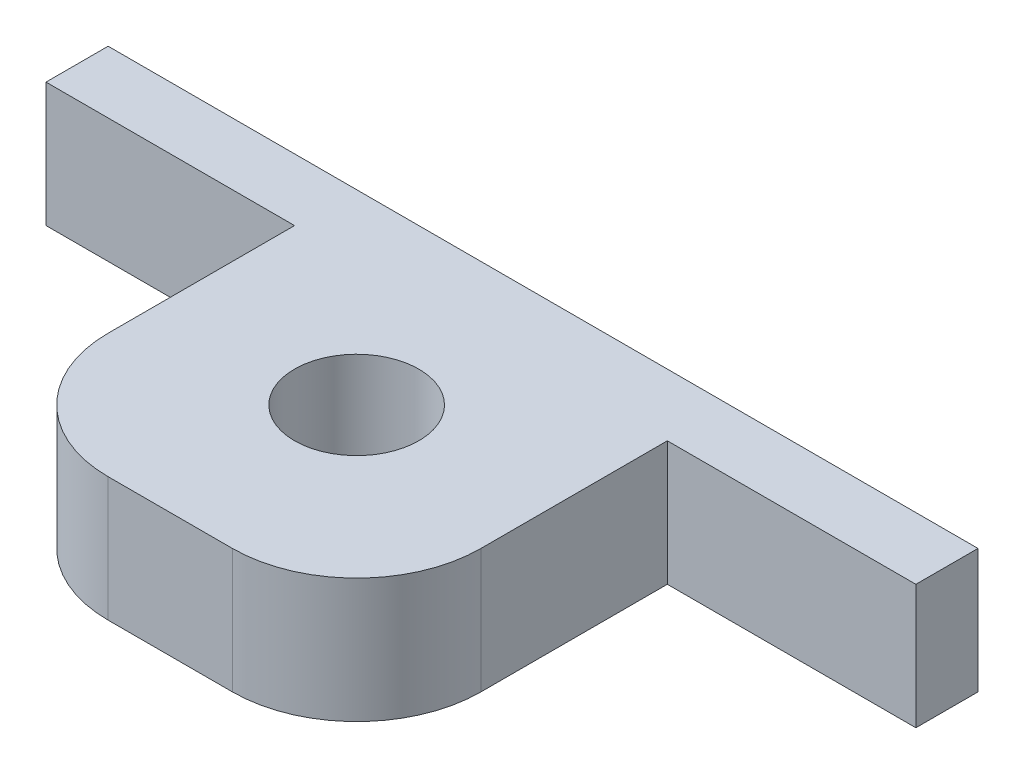
ISO-10303-21;
HEADER;
FILE_DESCRIPTION(('STEP AP214'),'2;1');
FILE_NAME('part.step','',(''),(''),'','','');
FILE_SCHEMA(('AUTOMOTIVE_DESIGN { 1 0 10303 214 1 1 1 1 }'));
ENDSEC;
DATA;
#1=APPLICATION_CONTEXT('core data for automotive mechanical design processes');
#2=APPLICATION_PROTOCOL_DEFINITION('international standard','automotive_design',2000,#1);
#3=PRODUCT_CONTEXT('',#1,'mechanical');
#4=PRODUCT('Part','Part','',(#3));
#5=PRODUCT_RELATED_PRODUCT_CATEGORY('part','',(#4));
#6=PRODUCT_DEFINITION_FORMATION('','',#4);
#7=PRODUCT_DEFINITION_CONTEXT('part definition',#1,'design');
#8=PRODUCT_DEFINITION('design','',#6,#7);
#9=PRODUCT_DEFINITION_SHAPE('','',#8);
#10=(LENGTH_UNIT() NAMED_UNIT(*) SI_UNIT(.MILLI.,.METRE.));
#11=(NAMED_UNIT(*) PLANE_ANGLE_UNIT() SI_UNIT($,.RADIAN.));
#12=(NAMED_UNIT(*) SI_UNIT($,.STERADIAN.) SOLID_ANGLE_UNIT());
#13=UNCERTAINTY_MEASURE_WITH_UNIT(LENGTH_MEASURE(1.E-05),#10,'distance_accuracy_value','');
#14=(GEOMETRIC_REPRESENTATION_CONTEXT(3) GLOBAL_UNCERTAINTY_ASSIGNED_CONTEXT((#13)) GLOBAL_UNIT_ASSIGNED_CONTEXT((#10,
#11,#12)) REPRESENTATION_CONTEXT('',''));
#15=CARTESIAN_POINT('',(0.,0.,0.));
#16=DIRECTION('',(0.,0.,1.));
#17=DIRECTION('',(1.,0.,0.));
#18=AXIS2_PLACEMENT_3D('',#15,#16,#17);
#19=CARTESIAN_POINT('',(0.,10.,0.));
#20=DIRECTION('',(0.,1.,0.));
#21=DIRECTION('',(0.,0.,1.));
#22=AXIS2_PLACEMENT_3D('',#19,#20,#21);
#23=PLANE('',#22);
#24=DIRECTION('',(0.,0.,1.));
#25=VECTOR('',#24,1.);
#26=CARTESIAN_POINT('',(-30.,10.,10.));
#27=LINE('',#26,#25);
#28=CARTESIAN_POINT('',(-30.,10.,10.));
#29=VERTEX_POINT('',#28);
#30=CARTESIAN_POINT('',(-30.,10.,40.));
#31=VERTEX_POINT('',#30);
#32=EDGE_CURVE('E179',#29,#31,#27,.T.);
#33=ORIENTED_EDGE('',*,*,#32,.T.);
#34=CARTESIAN_POINT('',(-9.99999999999999,10.,40.));
#35=DIRECTION('',(0.,1.,0.));
#36=DIRECTION('',(0.,0.,1.));
#37=AXIS2_PLACEMENT_3D('',#34,#35,#36);
#38=CIRCLE('',#37,20.);
#39=CARTESIAN_POINT('',(-9.99999999999999,10.,60.));
#40=VERTEX_POINT('',#39);
#41=EDGE_CURVE('E54',#31,#40,#38,.T.);
#42=ORIENTED_EDGE('',*,*,#41,.T.);
#43=DIRECTION('',(1.,0.,0.));
#44=VECTOR('',#43,1.);
#45=CARTESIAN_POINT('',(-30.,10.,60.));
#46=LINE('',#45,#44);
#47=CARTESIAN_POINT('',(9.99999999999999,10.,60.));
#48=VERTEX_POINT('',#47);
#49=EDGE_CURVE('E178',#40,#48,#46,.T.);
#50=ORIENTED_EDGE('',*,*,#49,.T.);
#51=CARTESIAN_POINT('',(9.99999999999999,10.,40.));
#52=DIRECTION('',(0.,1.,0.));
#53=DIRECTION('',(0.,0.,1.));
#54=AXIS2_PLACEMENT_3D('',#51,#52,#53);
#55=CIRCLE('',#54,20.);
#56=CARTESIAN_POINT('',(30.,10.,40.));
#57=VERTEX_POINT('',#56);
#58=EDGE_CURVE('E61',#48,#57,#55,.T.);
#59=ORIENTED_EDGE('',*,*,#58,.T.);
#60=DIRECTION('',(0.,0.,-1.));
#61=VECTOR('',#60,1.);
#62=CARTESIAN_POINT('',(30.,10.,60.));
#63=LINE('',#62,#61);
#64=CARTESIAN_POINT('',(30.,10.,10.));
#65=VERTEX_POINT('',#64);
#66=EDGE_CURVE('E188',#57,#65,#63,.T.);
#67=ORIENTED_EDGE('',*,*,#66,.T.);
#68=DIRECTION('',(1.,0.,0.));
#69=VECTOR('',#68,1.);
#70=CARTESIAN_POINT('',(30.,10.,10.));
#71=LINE('',#70,#69);
#72=CARTESIAN_POINT('',(70.,10.,10.));
#73=VERTEX_POINT('',#72);
#74=EDGE_CURVE('E142',#65,#73,#71,.T.);
#75=ORIENTED_EDGE('',*,*,#74,.T.);
#76=DIRECTION('',(0.,0.,-1.));
#77=VECTOR('',#76,1.);
#78=CARTESIAN_POINT('',(70.,10.,10.));
#79=LINE('',#78,#77);
#80=CARTESIAN_POINT('',(70.,10.,0.));
#81=VERTEX_POINT('',#80);
#82=EDGE_CURVE('E137',#73,#81,#79,.T.);
#83=ORIENTED_EDGE('',*,*,#82,.T.);
#84=DIRECTION('',(-1.,0.,0.));
#85=VECTOR('',#84,1.);
#86=CARTESIAN_POINT('',(70.,10.,0.));
#87=LINE('',#86,#85);
#88=CARTESIAN_POINT('',(-70.,10.,0.));
#89=VERTEX_POINT('',#88);
#90=EDGE_CURVE('E126',#81,#89,#87,.T.);
#91=ORIENTED_EDGE('',*,*,#90,.T.);
#92=DIRECTION('',(0.,0.,1.));
#93=VECTOR('',#92,1.);
#94=CARTESIAN_POINT('',(-70.,10.,0.));
#95=LINE('',#94,#93);
#96=CARTESIAN_POINT('',(-70.,10.,10.));
#97=VERTEX_POINT('',#96);
#98=EDGE_CURVE('E136',#89,#97,#95,.T.);
#99=ORIENTED_EDGE('',*,*,#98,.T.);
#100=DIRECTION('',(1.,0.,0.));
#101=VECTOR('',#100,1.);
#102=CARTESIAN_POINT('',(-70.,10.,10.));
#103=LINE('',#102,#101);
#104=EDGE_CURVE('E231',#97,#29,#103,.T.);
#105=ORIENTED_EDGE('',*,*,#104,.T.);
#106=EDGE_LOOP('',(#33,#42,#50,#59,#67,#75,#83,#91,#99,#105));
#107=FACE_BOUND('',#106,.T.);
#108=CARTESIAN_POINT('',(0.,10.,30.));
#109=DIRECTION('',(0.,1.,0.));
#110=DIRECTION('',(0.,0.,1.));
#111=AXIS2_PLACEMENT_3D('',#108,#109,#110);
#112=CIRCLE('',#111,10.);
#113=CARTESIAN_POINT('',(0.,10.,40.));
#114=VERTEX_POINT('',#113);
#115=EDGE_CURVE('E241',#114,#114,#112,.T.);
#116=ORIENTED_EDGE('',*,*,#115,.F.);
#117=EDGE_LOOP('',(#116));
#118=FACE_BOUND('',#117,.T.);
#119=ADVANCED_FACE('F45',(#107,#118),#23,.T.);
#120=CARTESIAN_POINT('',(0.,-10.,0.));
#121=DIRECTION('',(0.,1.,0.));
#122=DIRECTION('',(0.,0.,1.));
#123=AXIS2_PLACEMENT_3D('',#120,#121,#122);
#124=PLANE('',#123);
#125=DIRECTION('',(1.,0.,0.));
#126=VECTOR('',#125,1.);
#127=CARTESIAN_POINT('',(-30.,-10.,60.));
#128=LINE('',#127,#126);
#129=CARTESIAN_POINT('',(-9.99999999999999,-10.,60.));
#130=VERTEX_POINT('',#129);
#131=CARTESIAN_POINT('',(9.99999999999999,-10.,60.));
#132=VERTEX_POINT('',#131);
#133=EDGE_CURVE('E197',#130,#132,#128,.T.);
#134=ORIENTED_EDGE('',*,*,#133,.F.);
#135=CARTESIAN_POINT('',(-9.99999999999999,-10.,40.));
#136=DIRECTION('',(0.,1.,0.));
#137=DIRECTION('',(0.,0.,1.));
#138=AXIS2_PLACEMENT_3D('',#135,#136,#137);
#139=CIRCLE('',#138,20.);
#140=CARTESIAN_POINT('',(-30.,-10.,40.));
#141=VERTEX_POINT('',#140);
#142=EDGE_CURVE('E169',#130,#141,#139,.F.);
#143=ORIENTED_EDGE('',*,*,#142,.T.);
#144=DIRECTION('',(0.,0.,1.));
#145=VECTOR('',#144,1.);
#146=CARTESIAN_POINT('',(-30.,-10.,10.));
#147=LINE('',#146,#145);
#148=CARTESIAN_POINT('',(-30.,-10.,10.));
#149=VERTEX_POINT('',#148);
#150=EDGE_CURVE('E196',#149,#141,#147,.T.);
#151=ORIENTED_EDGE('',*,*,#150,.F.);
#152=DIRECTION('',(1.,0.,0.));
#153=VECTOR('',#152,1.);
#154=CARTESIAN_POINT('',(-70.,-10.,10.));
#155=LINE('',#154,#153);
#156=CARTESIAN_POINT('',(-70.,-10.,10.));
#157=VERTEX_POINT('',#156);
#158=EDGE_CURVE('E203',#157,#149,#155,.T.);
#159=ORIENTED_EDGE('',*,*,#158,.F.);
#160=DIRECTION('',(0.,0.,1.));
#161=VECTOR('',#160,1.);
#162=CARTESIAN_POINT('',(-70.,-10.,0.));
#163=LINE('',#162,#161);
#164=CARTESIAN_POINT('',(-70.,-10.,0.));
#165=VERTEX_POINT('',#164);
#166=EDGE_CURVE('E209',#165,#157,#163,.T.);
#167=ORIENTED_EDGE('',*,*,#166,.F.);
#168=DIRECTION('',(-1.,0.,0.));
#169=VECTOR('',#168,1.);
#170=CARTESIAN_POINT('',(70.,-10.,0.));
#171=LINE('',#170,#169);
#172=CARTESIAN_POINT('',(70.,-10.,0.));
#173=VERTEX_POINT('',#172);
#174=EDGE_CURVE('E234',#173,#165,#171,.T.);
#175=ORIENTED_EDGE('',*,*,#174,.F.);
#176=DIRECTION('',(0.,0.,-1.));
#177=VECTOR('',#176,1.);
#178=CARTESIAN_POINT('',(70.,-10.,10.));
#179=LINE('',#178,#177);
#180=CARTESIAN_POINT('',(70.,-10.,10.));
#181=VERTEX_POINT('',#180);
#182=EDGE_CURVE('E151',#181,#173,#179,.T.);
#183=ORIENTED_EDGE('',*,*,#182,.F.);
#184=DIRECTION('',(1.,0.,0.));
#185=VECTOR('',#184,1.);
#186=CARTESIAN_POINT('',(30.,-10.,10.));
#187=LINE('',#186,#185);
#188=CARTESIAN_POINT('',(30.,-10.,10.));
#189=VERTEX_POINT('',#188);
#190=EDGE_CURVE('E147',#189,#181,#187,.T.);
#191=ORIENTED_EDGE('',*,*,#190,.F.);
#192=DIRECTION('',(0.,0.,-1.));
#193=VECTOR('',#192,1.);
#194=CARTESIAN_POINT('',(30.,-10.,60.));
#195=LINE('',#194,#193);
#196=CARTESIAN_POINT('',(30.,-10.,40.));
#197=VERTEX_POINT('',#196);
#198=EDGE_CURVE('E207',#197,#189,#195,.T.);
#199=ORIENTED_EDGE('',*,*,#198,.F.);
#200=CARTESIAN_POINT('',(9.99999999999999,-10.,40.));
#201=DIRECTION('',(0.,1.,0.));
#202=DIRECTION('',(0.,0.,1.));
#203=AXIS2_PLACEMENT_3D('',#200,#201,#202);
#204=CIRCLE('',#203,20.);
#205=EDGE_CURVE('E166',#197,#132,#204,.F.);
#206=ORIENTED_EDGE('',*,*,#205,.T.);
#207=EDGE_LOOP('',(#134,#143,#151,#159,#167,#175,#183,#191,#199,#206));
#208=FACE_BOUND('',#207,.T.);
#209=CARTESIAN_POINT('',(0.,-10.,30.));
#210=DIRECTION('',(0.,1.,0.));
#211=DIRECTION('',(0.,0.,1.));
#212=AXIS2_PLACEMENT_3D('',#209,#210,#211);
#213=CIRCLE('',#212,10.);
#214=CARTESIAN_POINT('',(0.,-10.,40.));
#215=VERTEX_POINT('',#214);
#216=EDGE_CURVE('E252',#215,#215,#213,.T.);
#217=ORIENTED_EDGE('',*,*,#216,.T.);
#218=EDGE_LOOP('',(#217));
#219=FACE_BOUND('',#218,.T.);
#220=ADVANCED_FACE('F193',(#208,#219),#124,.F.);
#221=CARTESIAN_POINT('',(70.,10.,10.));
#222=DIRECTION('',(-1.,0.,0.));
#223=DIRECTION('',(0.,0.,1.));
#224=AXIS2_PLACEMENT_3D('',#221,#222,#223);
#225=PLANE('',#224);
#226=ORIENTED_EDGE('',*,*,#182,.T.);
#227=DIRECTION('',(0.,-1.,0.));
#228=VECTOR('',#227,1.);
#229=CARTESIAN_POINT('',(70.,10.,0.));
#230=LINE('',#229,#228);
#231=EDGE_CURVE('E130',#81,#173,#230,.T.);
#232=ORIENTED_EDGE('',*,*,#231,.F.);
#233=ORIENTED_EDGE('',*,*,#82,.F.);
#234=DIRECTION('',(0.,-1.,0.));
#235=VECTOR('',#234,1.);
#236=CARTESIAN_POINT('',(70.,10.,10.));
#237=LINE('',#236,#235);
#238=EDGE_CURVE('E217',#73,#181,#237,.T.);
#239=ORIENTED_EDGE('',*,*,#238,.T.);
#240=EDGE_LOOP('',(#226,#232,#233,#239));
#241=FACE_BOUND('',#240,.T.);
#242=ADVANCED_FACE('F149',(#241),#225,.F.);
#243=CARTESIAN_POINT('',(70.,10.,0.));
#244=DIRECTION('',(0.,0.,1.));
#245=DIRECTION('',(1.,0.,0.));
#246=AXIS2_PLACEMENT_3D('',#243,#244,#245);
#247=PLANE('',#246);
#248=ORIENTED_EDGE('',*,*,#174,.T.);
#249=DIRECTION('',(0.,-1.,0.));
#250=VECTOR('',#249,1.);
#251=CARTESIAN_POINT('',(-70.,10.,0.));
#252=LINE('',#251,#250);
#253=EDGE_CURVE('E133',#89,#165,#252,.T.);
#254=ORIENTED_EDGE('',*,*,#253,.F.);
#255=ORIENTED_EDGE('',*,*,#90,.F.);
#256=ORIENTED_EDGE('',*,*,#231,.T.);
#257=EDGE_LOOP('',(#248,#254,#255,#256));
#258=FACE_BOUND('',#257,.T.);
#259=ADVANCED_FACE('F128',(#258),#247,.F.);
#260=CARTESIAN_POINT('',(-70.,10.,0.));
#261=DIRECTION('',(1.,0.,0.));
#262=DIRECTION('',(0.,0.,-1.));
#263=AXIS2_PLACEMENT_3D('',#260,#261,#262);
#264=PLANE('',#263);
#265=ORIENTED_EDGE('',*,*,#166,.T.);
#266=DIRECTION('',(0.,-1.,0.));
#267=VECTOR('',#266,1.);
#268=CARTESIAN_POINT('',(-70.,10.,10.));
#269=LINE('',#268,#267);
#270=EDGE_CURVE('E159',#97,#157,#269,.T.);
#271=ORIENTED_EDGE('',*,*,#270,.F.);
#272=ORIENTED_EDGE('',*,*,#98,.F.);
#273=ORIENTED_EDGE('',*,*,#253,.T.);
#274=EDGE_LOOP('',(#265,#271,#272,#273));
#275=FACE_BOUND('',#274,.T.);
#276=ADVANCED_FACE('F285',(#275),#264,.F.);
#277=CARTESIAN_POINT('',(-70.,10.,10.));
#278=DIRECTION('',(0.,0.,-1.));
#279=DIRECTION('',(-1.,0.,0.));
#280=AXIS2_PLACEMENT_3D('',#277,#278,#279);
#281=PLANE('',#280);
#282=ORIENTED_EDGE('',*,*,#158,.T.);
#283=DIRECTION('',(0.,-1.,0.));
#284=VECTOR('',#283,1.);
#285=CARTESIAN_POINT('',(-30.,10.,10.));
#286=LINE('',#285,#284);
#287=EDGE_CURVE('E201',#29,#149,#286,.T.);
#288=ORIENTED_EDGE('',*,*,#287,.F.);
#289=ORIENTED_EDGE('',*,*,#104,.F.);
#290=ORIENTED_EDGE('',*,*,#270,.T.);
#291=EDGE_LOOP('',(#282,#288,#289,#290));
#292=FACE_BOUND('',#291,.T.);
#293=ADVANCED_FACE('F230',(#292),#281,.F.);
#294=CARTESIAN_POINT('',(-30.,10.,10.));
#295=DIRECTION('',(1.,0.,0.));
#296=DIRECTION('',(0.,0.,-1.));
#297=AXIS2_PLACEMENT_3D('',#294,#295,#296);
#298=PLANE('',#297);
#299=ORIENTED_EDGE('',*,*,#150,.T.);
#300=DIRECTION('',(0.,-1.,0.));
#301=VECTOR('',#300,1.);
#302=CARTESIAN_POINT('',(-30.,10.,40.));
#303=LINE('',#302,#301);
#304=EDGE_CURVE('E69',#141,#31,#303,.F.);
#305=ORIENTED_EDGE('',*,*,#304,.T.);
#306=ORIENTED_EDGE('',*,*,#32,.F.);
#307=ORIENTED_EDGE('',*,*,#287,.T.);
#308=EDGE_LOOP('',(#299,#305,#306,#307));
#309=FACE_BOUND('',#308,.T.);
#310=ADVANCED_FACE('F199',(#309),#298,.F.);
#311=CARTESIAN_POINT('',(-30.,10.,60.));
#312=DIRECTION('',(0.,0.,-1.));
#313=DIRECTION('',(-1.,0.,0.));
#314=AXIS2_PLACEMENT_3D('',#311,#312,#313);
#315=PLANE('',#314);
#316=ORIENTED_EDGE('',*,*,#49,.F.);
#317=DIRECTION('',(0.,-1.,0.));
#318=VECTOR('',#317,1.);
#319=CARTESIAN_POINT('',(-9.99999999999999,10.,60.));
#320=LINE('',#319,#318);
#321=EDGE_CURVE('E157',#40,#130,#320,.T.);
#322=ORIENTED_EDGE('',*,*,#321,.T.);
#323=ORIENTED_EDGE('',*,*,#133,.T.);
#324=DIRECTION('',(0.,-1.,0.));
#325=VECTOR('',#324,1.);
#326=CARTESIAN_POINT('',(9.99999999999999,10.,60.));
#327=LINE('',#326,#325);
#328=EDGE_CURVE('E153',#132,#48,#327,.F.);
#329=ORIENTED_EDGE('',*,*,#328,.T.);
#330=EDGE_LOOP('',(#316,#322,#323,#329));
#331=FACE_BOUND('',#330,.T.);
#332=ADVANCED_FACE('F183',(#331),#315,.F.);
#333=CARTESIAN_POINT('',(30.,10.,60.));
#334=DIRECTION('',(-1.,0.,0.));
#335=DIRECTION('',(0.,0.,1.));
#336=AXIS2_PLACEMENT_3D('',#333,#334,#335);
#337=PLANE('',#336);
#338=ORIENTED_EDGE('',*,*,#66,.F.);
#339=DIRECTION('',(0.,-1.,0.));
#340=VECTOR('',#339,1.);
#341=CARTESIAN_POINT('',(30.,10.,40.));
#342=LINE('',#341,#340);
#343=EDGE_CURVE('E11',#57,#197,#342,.T.);
#344=ORIENTED_EDGE('',*,*,#343,.T.);
#345=ORIENTED_EDGE('',*,*,#198,.T.);
#346=DIRECTION('',(0.,-1.,0.));
#347=VECTOR('',#346,1.);
#348=CARTESIAN_POINT('',(30.,10.,10.));
#349=LINE('',#348,#347);
#350=EDGE_CURVE('E220',#65,#189,#349,.T.);
#351=ORIENTED_EDGE('',*,*,#350,.F.);
#352=EDGE_LOOP('',(#338,#344,#345,#351));
#353=FACE_BOUND('',#352,.T.);
#354=ADVANCED_FACE('F274',(#353),#337,.F.);
#355=CARTESIAN_POINT('',(30.,10.,10.));
#356=DIRECTION('',(0.,0.,-1.));
#357=DIRECTION('',(-1.,0.,0.));
#358=AXIS2_PLACEMENT_3D('',#355,#356,#357);
#359=PLANE('',#358);
#360=ORIENTED_EDGE('',*,*,#190,.T.);
#361=ORIENTED_EDGE('',*,*,#238,.F.);
#362=ORIENTED_EDGE('',*,*,#74,.F.);
#363=ORIENTED_EDGE('',*,*,#350,.T.);
#364=EDGE_LOOP('',(#360,#361,#362,#363));
#365=FACE_BOUND('',#364,.T.);
#366=ADVANCED_FACE('F271',(#365),#359,.F.);
#367=CARTESIAN_POINT('',(0.,10.,30.));
#368=DIRECTION('',(0.,-1.,0.));
#369=DIRECTION('',(0.,0.,-1.));
#370=AXIS2_PLACEMENT_3D('',#367,#368,#369);
#371=CYLINDRICAL_SURFACE('',#370,10.);
#372=ORIENTED_EDGE('',*,*,#115,.T.);
#373=EDGE_LOOP('',(#372));
#374=FACE_BOUND('',#373,.T.);
#375=ORIENTED_EDGE('',*,*,#216,.F.);
#376=EDGE_LOOP('',(#375));
#377=FACE_BOUND('',#376,.T.);
#378=ADVANCED_FACE('F260',(#374,#377),#371,.F.);
#379=CARTESIAN_POINT('',(-9.99999999999999,10.,40.));
#380=DIRECTION('',(0.,-1.,0.));
#381=DIRECTION('',(0.,0.,-1.));
#382=AXIS2_PLACEMENT_3D('',#379,#380,#381);
#383=CYLINDRICAL_SURFACE('',#382,20.);
#384=ORIENTED_EDGE('',*,*,#41,.F.);
#385=ORIENTED_EDGE('',*,*,#304,.F.);
#386=ORIENTED_EDGE('',*,*,#142,.F.);
#387=ORIENTED_EDGE('',*,*,#321,.F.);
#388=EDGE_LOOP('',(#384,#385,#386,#387));
#389=FACE_BOUND('',#388,.T.);
#390=ADVANCED_FACE('F190',(#389),#383,.T.);
#391=CARTESIAN_POINT('',(9.99999999999999,10.,40.));
#392=DIRECTION('',(0.,-1.,0.));
#393=DIRECTION('',(0.,0.,-1.));
#394=AXIS2_PLACEMENT_3D('',#391,#392,#393);
#395=CYLINDRICAL_SURFACE('',#394,20.);
#396=ORIENTED_EDGE('',*,*,#58,.F.);
#397=ORIENTED_EDGE('',*,*,#328,.F.);
#398=ORIENTED_EDGE('',*,*,#205,.F.);
#399=ORIENTED_EDGE('',*,*,#343,.F.);
#400=EDGE_LOOP('',(#396,#397,#398,#399));
#401=FACE_BOUND('',#400,.T.);
#402=ADVANCED_FACE('F47',(#401),#395,.T.);
#403=CLOSED_SHELL('',(#119,#220,#242,#259,#276,#293,#310,#332,#354,#366,#378,#390,#402));
#404=MANIFOLD_SOLID_BREP('B2',#403);
#405=ADVANCED_BREP_SHAPE_REPRESENTATION('',(#18,#404),#14);
#406=SHAPE_DEFINITION_REPRESENTATION(#9,#405);
ENDSEC;
END-ISO-10303-21;
